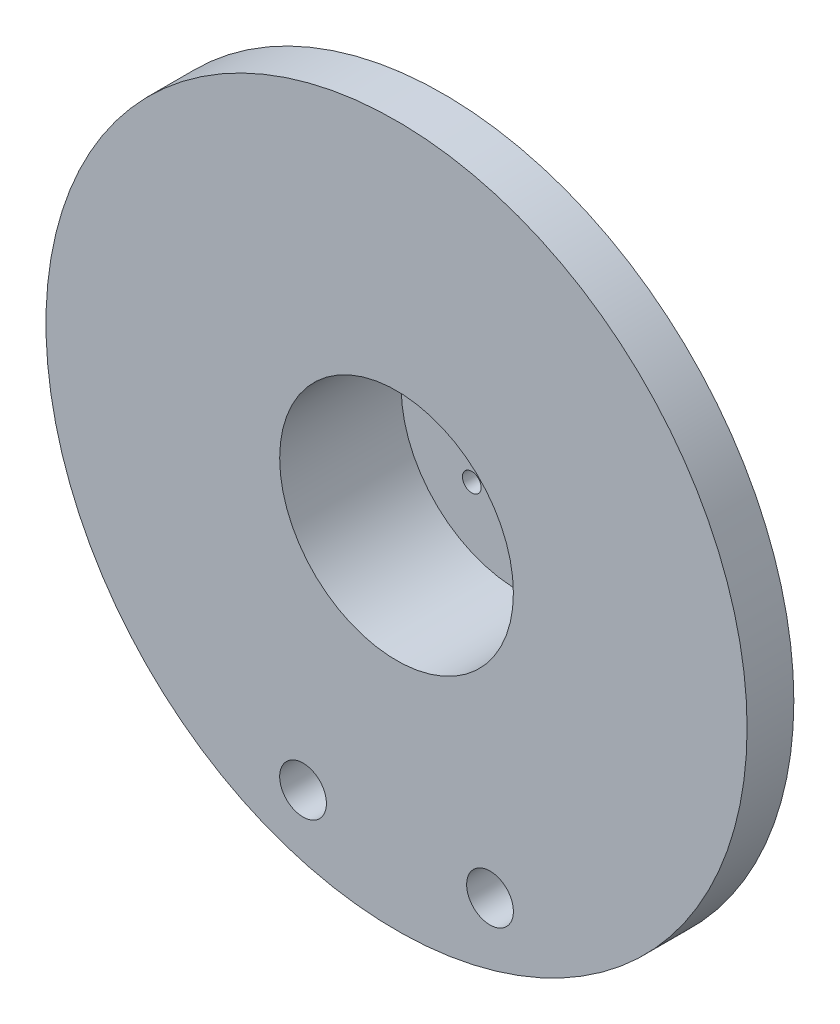
ISO-10303-21;
HEADER;
FILE_DESCRIPTION(('STEP AP214'),'2;1');
FILE_NAME('part.step','',(''),(''),'','','');
FILE_SCHEMA(('AUTOMOTIVE_DESIGN { 1 0 10303 214 1 1 1 1 }'));
ENDSEC;
DATA;
#1=APPLICATION_CONTEXT('core data for automotive mechanical design processes');
#2=APPLICATION_PROTOCOL_DEFINITION('international standard','automotive_design',2000,#1);
#3=PRODUCT_CONTEXT('',#1,'mechanical');
#4=PRODUCT('Part','Part','',(#3));
#5=PRODUCT_RELATED_PRODUCT_CATEGORY('part','',(#4));
#6=PRODUCT_DEFINITION_FORMATION('','',#4);
#7=PRODUCT_DEFINITION_CONTEXT('part definition',#1,'design');
#8=PRODUCT_DEFINITION('design','',#6,#7);
#9=PRODUCT_DEFINITION_SHAPE('','',#8);
#10=(LENGTH_UNIT() NAMED_UNIT(*) SI_UNIT(.MILLI.,.METRE.));
#11=(NAMED_UNIT(*) PLANE_ANGLE_UNIT() SI_UNIT($,.RADIAN.));
#12=(NAMED_UNIT(*) SI_UNIT($,.STERADIAN.) SOLID_ANGLE_UNIT());
#13=UNCERTAINTY_MEASURE_WITH_UNIT(LENGTH_MEASURE(1.E-05),#10,'distance_accuracy_value','');
#14=(GEOMETRIC_REPRESENTATION_CONTEXT(3) GLOBAL_UNCERTAINTY_ASSIGNED_CONTEXT((#13)) GLOBAL_UNIT_ASSIGNED_CONTEXT((#10,
#11,#12)) REPRESENTATION_CONTEXT('',''));
#15=CARTESIAN_POINT('',(0.,0.,0.));
#16=DIRECTION('',(0.,0.,1.));
#17=DIRECTION('',(1.,0.,0.));
#18=AXIS2_PLACEMENT_3D('',#15,#16,#17);
#19=CARTESIAN_POINT('',(0.,0.,5.));
#20=DIRECTION('',(0.,0.,-1.));
#21=DIRECTION('',(-1.,0.,0.));
#22=AXIS2_PLACEMENT_3D('',#19,#20,#21);
#23=CYLINDRICAL_SURFACE('',#22,12.5);
#24=CARTESIAN_POINT('',(0.,0.,5.));
#25=DIRECTION('',(0.,0.,1.));
#26=DIRECTION('',(1.,0.,0.));
#27=AXIS2_PLACEMENT_3D('',#24,#25,#26);
#28=CIRCLE('',#27,12.5);
#29=CARTESIAN_POINT('',(12.5,0.,5.));
#30=VERTEX_POINT('',#29);
#31=EDGE_CURVE('E48',#30,#30,#28,.T.);
#32=ORIENTED_EDGE('',*,*,#31,.T.);
#33=EDGE_LOOP('',(#32));
#34=FACE_BOUND('',#33,.T.);
#35=CARTESIAN_POINT('',(0.,0.,-8.));
#36=DIRECTION('',(0.,0.,-1.));
#37=DIRECTION('',(-1.,0.,0.));
#38=AXIS2_PLACEMENT_3D('',#35,#36,#37);
#39=CIRCLE('',#38,12.5);
#40=CARTESIAN_POINT('',(-12.5,0.,-8.));
#41=VERTEX_POINT('',#40);
#42=EDGE_CURVE('E55',#41,#41,#39,.T.);
#43=ORIENTED_EDGE('',*,*,#42,.T.);
#44=EDGE_LOOP('',(#43));
#45=FACE_BOUND('',#44,.T.);
#46=ADVANCED_FACE('F32',(#34,#45),#23,.F.);
#47=CARTESIAN_POINT('',(0.,0.,0.));
#48=DIRECTION('',(0.,0.,1.));
#49=DIRECTION('',(1.,0.,0.));
#50=AXIS2_PLACEMENT_3D('',#47,#48,#49);
#51=PLANE('',#50);
#52=CARTESIAN_POINT('',(-10.,-29.5,0.));
#53=DIRECTION('',(0.,0.,1.));
#54=DIRECTION('',(1.,0.,0.));
#55=AXIS2_PLACEMENT_3D('',#52,#53,#54);
#56=CIRCLE('',#55,2.5);
#57=CARTESIAN_POINT('',(-7.5,-29.5,0.));
#58=VERTEX_POINT('',#57);
#59=EDGE_CURVE('E110',#58,#58,#56,.T.);
#60=ORIENTED_EDGE('',*,*,#59,.T.);
#61=EDGE_LOOP('',(#60));
#62=FACE_BOUND('',#61,.T.);
#63=CARTESIAN_POINT('',(10.,-29.5,0.));
#64=DIRECTION('',(0.,0.,1.));
#65=DIRECTION('',(1.,0.,0.));
#66=AXIS2_PLACEMENT_3D('',#63,#64,#65);
#67=CIRCLE('',#66,2.5);
#68=CARTESIAN_POINT('',(12.5,-29.5,0.));
#69=VERTEX_POINT('',#68);
#70=EDGE_CURVE('E116',#69,#69,#67,.T.);
#71=ORIENTED_EDGE('',*,*,#70,.T.);
#72=EDGE_LOOP('',(#71));
#73=FACE_BOUND('',#72,.T.);
#74=CARTESIAN_POINT('',(0.,0.,0.));
#75=DIRECTION('',(0.,0.,1.));
#76=DIRECTION('',(1.,0.,0.));
#77=AXIS2_PLACEMENT_3D('',#74,#75,#76);
#78=CIRCLE('',#77,37.5);
#79=CARTESIAN_POINT('',(37.5,0.,0.));
#80=VERTEX_POINT('',#79);
#81=EDGE_CURVE('E43',#80,#80,#78,.T.);
#82=ORIENTED_EDGE('',*,*,#81,.F.);
#83=EDGE_LOOP('',(#82));
#84=FACE_BOUND('',#83,.T.);
#85=CARTESIAN_POINT('',(0.,0.,0.));
#86=DIRECTION('',(0.,0.,1.));
#87=DIRECTION('',(1.,0.,0.));
#88=AXIS2_PLACEMENT_3D('',#85,#86,#87);
#89=CIRCLE('',#88,17.5);
#90=CARTESIAN_POINT('',(17.5,0.,0.));
#91=VERTEX_POINT('',#90);
#92=EDGE_CURVE('E10',#91,#91,#89,.F.);
#93=ORIENTED_EDGE('',*,*,#92,.F.);
#94=EDGE_LOOP('',(#93));
#95=FACE_BOUND('',#94,.T.);
#96=ADVANCED_FACE('F125',(#62,#73,#84,#95),#51,.F.);
#97=CARTESIAN_POINT('',(0.,0.,5.));
#98=DIRECTION('',(0.,0.,1.));
#99=DIRECTION('',(1.,0.,0.));
#100=AXIS2_PLACEMENT_3D('',#97,#98,#99);
#101=PLANE('',#100);
#102=CARTESIAN_POINT('',(-10.,-29.5,5.));
#103=DIRECTION('',(0.,0.,1.));
#104=DIRECTION('',(1.,0.,0.));
#105=AXIS2_PLACEMENT_3D('',#102,#103,#104);
#106=CIRCLE('',#105,2.5);
#107=CARTESIAN_POINT('',(-7.5,-29.5,5.));
#108=VERTEX_POINT('',#107);
#109=EDGE_CURVE('E119',#108,#108,#106,.T.);
#110=ORIENTED_EDGE('',*,*,#109,.F.);
#111=EDGE_LOOP('',(#110));
#112=FACE_BOUND('',#111,.T.);
#113=CARTESIAN_POINT('',(10.,-29.5,5.));
#114=DIRECTION('',(0.,0.,1.));
#115=DIRECTION('',(1.,0.,0.));
#116=AXIS2_PLACEMENT_3D('',#113,#114,#115);
#117=CIRCLE('',#116,2.5);
#118=CARTESIAN_POINT('',(12.5,-29.5,5.));
#119=VERTEX_POINT('',#118);
#120=EDGE_CURVE('E113',#119,#119,#117,.T.);
#121=ORIENTED_EDGE('',*,*,#120,.F.);
#122=EDGE_LOOP('',(#121));
#123=FACE_BOUND('',#122,.T.);
#124=CARTESIAN_POINT('',(0.,0.,5.));
#125=DIRECTION('',(0.,0.,1.));
#126=DIRECTION('',(1.,0.,0.));
#127=AXIS2_PLACEMENT_3D('',#124,#125,#126);
#128=CIRCLE('',#127,37.5);
#129=CARTESIAN_POINT('',(37.5,0.,5.));
#130=VERTEX_POINT('',#129);
#131=EDGE_CURVE('E39',#130,#130,#128,.T.);
#132=ORIENTED_EDGE('',*,*,#131,.T.);
#133=EDGE_LOOP('',(#132));
#134=FACE_BOUND('',#133,.T.);
#135=ORIENTED_EDGE('',*,*,#31,.F.);
#136=EDGE_LOOP('',(#135));
#137=FACE_BOUND('',#136,.T.);
#138=ADVANCED_FACE('F135',(#112,#123,#134,#137),#101,.T.);
#139=CARTESIAN_POINT('',(0.,0.,5.));
#140=DIRECTION('',(0.,0.,-1.));
#141=DIRECTION('',(-1.,0.,0.));
#142=AXIS2_PLACEMENT_3D('',#139,#140,#141);
#143=CYLINDRICAL_SURFACE('',#142,37.5);
#144=ORIENTED_EDGE('',*,*,#131,.F.);
#145=EDGE_LOOP('',(#144));
#146=FACE_BOUND('',#145,.T.);
#147=ORIENTED_EDGE('',*,*,#81,.T.);
#148=EDGE_LOOP('',(#147));
#149=FACE_BOUND('',#148,.T.);
#150=ADVANCED_FACE('F34',(#146,#149),#143,.T.);
#151=CARTESIAN_POINT('',(0.,0.,-13.));
#152=DIRECTION('',(0.,0.,-1.));
#153=DIRECTION('',(-1.,0.,0.));
#154=AXIS2_PLACEMENT_3D('',#151,#152,#153);
#155=PLANE('',#154);
#156=CARTESIAN_POINT('',(0.,0.,-13.));
#157=DIRECTION('',(0.,0.,-1.));
#158=DIRECTION('',(-1.,0.,0.));
#159=AXIS2_PLACEMENT_3D('',#156,#157,#158);
#160=CIRCLE('',#159,17.5);
#161=CARTESIAN_POINT('',(17.5,0.,-13.));
#162=VERTEX_POINT('',#161);
#163=EDGE_CURVE('E52',#162,#162,#160,.T.);
#164=ORIENTED_EDGE('',*,*,#163,.T.);
#165=EDGE_LOOP('',(#164));
#166=FACE_BOUND('',#165,.T.);
#167=CARTESIAN_POINT('',(-4.94974746830589,4.94974746830577,-13.));
#168=DIRECTION('',(0.,0.,-1.));
#169=DIRECTION('',(-1.,0.,0.));
#170=AXIS2_PLACEMENT_3D('',#167,#168,#169);
#171=CIRCLE('',#170,1.);
#172=CARTESIAN_POINT('',(-5.94974746830589,4.94974746830577,-13.));
#173=VERTEX_POINT('',#172);
#174=EDGE_CURVE('E107',#173,#173,#171,.T.);
#175=ORIENTED_EDGE('',*,*,#174,.F.);
#176=EDGE_LOOP('',(#175));
#177=FACE_BOUND('',#176,.T.);
#178=CARTESIAN_POINT('',(0.,7.,-13.));
#179=DIRECTION('',(0.,0.,-1.));
#180=DIRECTION('',(-1.,0.,0.));
#181=AXIS2_PLACEMENT_3D('',#178,#179,#180);
#182=CIRCLE('',#181,1.);
#183=CARTESIAN_POINT('',(-1.00000000000007,7.,-13.));
#184=VERTEX_POINT('',#183);
#185=EDGE_CURVE('E101',#184,#184,#182,.T.);
#186=ORIENTED_EDGE('',*,*,#185,.F.);
#187=EDGE_LOOP('',(#186));
#188=FACE_BOUND('',#187,.T.);
#189=CARTESIAN_POINT('',(4.94974746830579,4.94974746830588,-13.));
#190=DIRECTION('',(0.,0.,-1.));
#191=DIRECTION('',(-1.,0.,0.));
#192=AXIS2_PLACEMENT_3D('',#189,#190,#191);
#193=CIRCLE('',#192,1.);
#194=CARTESIAN_POINT('',(3.94974746830579,4.94974746830588,-13.));
#195=VERTEX_POINT('',#194);
#196=EDGE_CURVE('E95',#195,#195,#193,.T.);
#197=ORIENTED_EDGE('',*,*,#196,.F.);
#198=EDGE_LOOP('',(#197));
#199=FACE_BOUND('',#198,.T.);
#200=CARTESIAN_POINT('',(7.,0.,-13.));
#201=DIRECTION('',(0.,0.,-1.));
#202=DIRECTION('',(-1.,0.,0.));
#203=AXIS2_PLACEMENT_3D('',#200,#201,#202);
#204=CIRCLE('',#203,1.);
#205=CARTESIAN_POINT('',(6.,0.,-13.));
#206=VERTEX_POINT('',#205);
#207=EDGE_CURVE('E89',#206,#206,#204,.T.);
#208=ORIENTED_EDGE('',*,*,#207,.F.);
#209=EDGE_LOOP('',(#208));
#210=FACE_BOUND('',#209,.T.);
#211=CARTESIAN_POINT('',(4.94974746830586,-4.94974746830581,-13.));
#212=DIRECTION('',(0.,0.,-1.));
#213=DIRECTION('',(-1.,0.,0.));
#214=AXIS2_PLACEMENT_3D('',#211,#212,#213);
#215=CIRCLE('',#214,1.);
#216=CARTESIAN_POINT('',(3.94974746830586,-4.94974746830581,-13.));
#217=VERTEX_POINT('',#216);
#218=EDGE_CURVE('E83',#217,#217,#215,.T.);
#219=ORIENTED_EDGE('',*,*,#218,.F.);
#220=EDGE_LOOP('',(#219));
#221=FACE_BOUND('',#220,.T.);
#222=CARTESIAN_POINT('',(0.,-7.,-13.));
#223=DIRECTION('',(0.,0.,-1.));
#224=DIRECTION('',(-1.,0.,0.));
#225=AXIS2_PLACEMENT_3D('',#222,#223,#224);
#226=CIRCLE('',#225,1.);
#227=CARTESIAN_POINT('',(-0.999999999999977,-7.,-13.));
#228=VERTEX_POINT('',#227);
#229=EDGE_CURVE('E77',#228,#228,#226,.T.);
#230=ORIENTED_EDGE('',*,*,#229,.F.);
#231=EDGE_LOOP('',(#230));
#232=FACE_BOUND('',#231,.T.);
#233=CARTESIAN_POINT('',(-4.94974746830583,-4.94974746830584,-13.));
#234=DIRECTION('',(0.,0.,-1.));
#235=DIRECTION('',(-1.,0.,0.));
#236=AXIS2_PLACEMENT_3D('',#233,#234,#235);
#237=CIRCLE('',#236,1.);
#238=CARTESIAN_POINT('',(-5.94974746830583,-4.94974746830584,-13.));
#239=VERTEX_POINT('',#238);
#240=EDGE_CURVE('E71',#239,#239,#237,.T.);
#241=ORIENTED_EDGE('',*,*,#240,.F.);
#242=EDGE_LOOP('',(#241));
#243=FACE_BOUND('',#242,.T.);
#244=CARTESIAN_POINT('',(-7.,0.,-13.));
#245=DIRECTION('',(0.,0.,-1.));
#246=DIRECTION('',(-1.,0.,0.));
#247=AXIS2_PLACEMENT_3D('',#244,#245,#246);
#248=CIRCLE('',#247,1.);
#249=CARTESIAN_POINT('',(-8.,0.,-13.));
#250=VERTEX_POINT('',#249);
#251=EDGE_CURVE('E65',#250,#250,#248,.T.);
#252=ORIENTED_EDGE('',*,*,#251,.F.);
#253=EDGE_LOOP('',(#252));
#254=FACE_BOUND('',#253,.T.);
#255=CARTESIAN_POINT('',(0.,0.,-13.));
#256=DIRECTION('',(0.,0.,-1.));
#257=DIRECTION('',(-1.,0.,0.));
#258=AXIS2_PLACEMENT_3D('',#255,#256,#257);
#259=CIRCLE('',#258,5.);
#260=CARTESIAN_POINT('',(-5.,0.,-13.));
#261=VERTEX_POINT('',#260);
#262=EDGE_CURVE('E59',#261,#261,#259,.T.);
#263=ORIENTED_EDGE('',*,*,#262,.F.);
#264=EDGE_LOOP('',(#263));
#265=FACE_BOUND('',#264,.T.);
#266=ADVANCED_FACE('F161',(#166,#177,#188,#199,#210,#221,#232,#243,#254,#265),#155,.T.);
#267=CARTESIAN_POINT('',(0.,0.,-13.));
#268=DIRECTION('',(0.,0.,1.));
#269=DIRECTION('',(1.,0.,0.));
#270=AXIS2_PLACEMENT_3D('',#267,#268,#269);
#271=CYLINDRICAL_SURFACE('',#270,17.5);
#272=CARTESIAN_POINT('',(17.5,0.,-13.));
#273=CARTESIAN_POINT('',(17.5,0.,-12.8645833333333));
#274=CARTESIAN_POINT('',(17.5,0.,-12.7291666666667));
#275=CARTESIAN_POINT('',(17.5,0.,-12.4583333333333));
#276=CARTESIAN_POINT('',(17.5,0.,-12.3229166666667));
#277=CARTESIAN_POINT('',(17.5,0.,-12.0520833333333));
#278=CARTESIAN_POINT('',(17.5,0.,-11.9166666666667));
#279=CARTESIAN_POINT('',(17.5,0.,-11.6458333333333));
#280=CARTESIAN_POINT('',(17.5,0.,-11.5104166666667));
#281=CARTESIAN_POINT('',(17.5,0.,-11.2395833333333));
#282=CARTESIAN_POINT('',(17.5,0.,-11.1041666666667));
#283=CARTESIAN_POINT('',(17.5,0.,-10.8333333333333));
#284=CARTESIAN_POINT('',(17.5,0.,-10.6979166666667));
#285=CARTESIAN_POINT('',(17.5,0.,-10.4270833333333));
#286=CARTESIAN_POINT('',(17.5,0.,-10.2916666666667));
#287=CARTESIAN_POINT('',(17.5,0.,-10.0208333333333));
#288=CARTESIAN_POINT('',(17.5,0.,-9.88541666666667));
#289=CARTESIAN_POINT('',(17.5,0.,-9.61458333333333));
#290=CARTESIAN_POINT('',(17.5,0.,-9.47916666666667));
#291=CARTESIAN_POINT('',(17.5,0.,-9.20833333333333));
#292=CARTESIAN_POINT('',(17.5,0.,-9.07291666666667));
#293=CARTESIAN_POINT('',(17.5,0.,-8.80208333333333));
#294=CARTESIAN_POINT('',(17.5,0.,-8.66666666666667));
#295=CARTESIAN_POINT('',(17.5,0.,-8.39583333333333));
#296=CARTESIAN_POINT('',(17.5,0.,-8.26041666666667));
#297=CARTESIAN_POINT('',(17.5,0.,-7.98958333333333));
#298=CARTESIAN_POINT('',(17.5,0.,-7.85416666666667));
#299=CARTESIAN_POINT('',(17.5,0.,-7.58333333333333));
#300=CARTESIAN_POINT('',(17.5,0.,-7.44791666666667));
#301=CARTESIAN_POINT('',(17.5,0.,-7.17708333333333));
#302=CARTESIAN_POINT('',(17.5,0.,-7.04166666666667));
#303=CARTESIAN_POINT('',(17.5,0.,-6.77083333333333));
#304=CARTESIAN_POINT('',(17.5,0.,-6.63541666666667));
#305=CARTESIAN_POINT('',(17.5,0.,-6.36458333333333));
#306=CARTESIAN_POINT('',(17.5,0.,-6.22916666666667));
#307=CARTESIAN_POINT('',(17.5,0.,-5.95833333333333));
#308=CARTESIAN_POINT('',(17.5,0.,-5.82291666666667));
#309=CARTESIAN_POINT('',(17.5,0.,-5.55208333333333));
#310=CARTESIAN_POINT('',(17.5,0.,-5.41666666666667));
#311=CARTESIAN_POINT('',(17.5,0.,-5.14583333333333));
#312=CARTESIAN_POINT('',(17.5,0.,-5.01041666666667));
#313=CARTESIAN_POINT('',(17.5,0.,-4.73958333333333));
#314=CARTESIAN_POINT('',(17.5,0.,-4.60416666666667));
#315=CARTESIAN_POINT('',(17.5,0.,-4.33333333333333));
#316=CARTESIAN_POINT('',(17.5,0.,-4.19791666666667));
#317=CARTESIAN_POINT('',(17.5,0.,-3.92708333333333));
#318=CARTESIAN_POINT('',(17.5,0.,-3.79166666666667));
#319=CARTESIAN_POINT('',(17.5,0.,-3.52083333333333));
#320=CARTESIAN_POINT('',(17.5,0.,-3.38541666666667));
#321=CARTESIAN_POINT('',(17.5,0.,-3.11458333333333));
#322=CARTESIAN_POINT('',(17.5,0.,-2.97916666666667));
#323=CARTESIAN_POINT('',(17.5,0.,-2.70833333333333));
#324=CARTESIAN_POINT('',(17.5,0.,-2.57291666666667));
#325=CARTESIAN_POINT('',(17.5,0.,-2.30208333333333));
#326=CARTESIAN_POINT('',(17.5,0.,-2.16666666666667));
#327=CARTESIAN_POINT('',(17.5,0.,-1.89583333333333));
#328=CARTESIAN_POINT('',(17.5,0.,-1.76041666666667));
#329=CARTESIAN_POINT('',(17.5,0.,-1.48958333333333));
#330=CARTESIAN_POINT('',(17.5,0.,-1.35416666666667));
#331=CARTESIAN_POINT('',(17.5,0.,-1.08333333333333));
#332=CARTESIAN_POINT('',(17.5,0.,-0.947916666666667));
#333=CARTESIAN_POINT('',(17.5,0.,-0.677083333333334));
#334=CARTESIAN_POINT('',(17.5,0.,-0.541666666666667));
#335=CARTESIAN_POINT('',(17.5,0.,-0.270833333333334));
#336=CARTESIAN_POINT('',(17.5,0.,-0.135416666666667));
#337=CARTESIAN_POINT('',(17.5,0.,0.));
#338=B_SPLINE_CURVE_WITH_KNOTS('',3,(#272,#273,#274,#275,#276,#277,#278,#279,#280,#281,#282,
#283,#284,#285,#286,#287,#288,#289,#290,#291,#292,#293,#294,#295,#296,#297,#298,#299,#300,#301,
#302,#303,#304,#305,#306,#307,#308,#309,#310,#311,#312,#313,#314,#315,#316,#317,#318,#319,#320,
#321,#322,#323,#324,#325,#326,#327,#328,#329,#330,#331,#332,#333,#334,#335,#336,#337),
.UNSPECIFIED.,.F.,.F.,(4,2,2,2,2,2,2,2,2,2,2,2,2,2,2,2,2,2,2,2,2,2,2,2,2,2,2,2,2,2,2,2,4),(0.,
0.406249999999999,0.812499999999999,1.21875,1.625,2.03125,2.4375,2.84375,3.25,3.65625,4.0625,
4.46875,4.875,5.28125,5.6875,6.09375,6.5,6.90625,7.3125,7.71875,8.125,8.53125,8.9375,9.34375,
9.75,10.15625,10.5625,10.96875,11.375,11.78125,12.1875,12.59375,13.),.UNSPECIFIED.);
#339=EDGE_CURVE('BSEAM151',#162,#91,#338,.T.);
#340=ORIENTED_EDGE('',*,*,#163,.F.);
#341=ORIENTED_EDGE('',*,*,#92,.T.);
#342=ORIENTED_EDGE('',*,*,#339,.T.);
#343=ORIENTED_EDGE('',*,*,#339,.F.);
#344=EDGE_LOOP('',(#340,#342,#341,#343));
#345=FACE_BOUND('',#344,.T.);
#346=ADVANCED_FACE('F151',(#345),#271,.T.);
#347=CARTESIAN_POINT('',(0.,0.,-8.));
#348=DIRECTION('',(0.,0.,-1.));
#349=DIRECTION('',(-1.,0.,0.));
#350=AXIS2_PLACEMENT_3D('',#347,#348,#349);
#351=PLANE('',#350);
#352=CARTESIAN_POINT('',(-4.94974746830589,4.94974746830577,-8.));
#353=DIRECTION('',(0.,0.,-1.));
#354=DIRECTION('',(-1.,0.,0.));
#355=AXIS2_PLACEMENT_3D('',#352,#353,#354);
#356=CIRCLE('',#355,1.);
#357=CARTESIAN_POINT('',(-5.94974746830589,4.94974746830577,-8.));
#358=VERTEX_POINT('',#357);
#359=EDGE_CURVE('E104',#358,#358,#356,.T.);
#360=ORIENTED_EDGE('',*,*,#359,.T.);
#361=EDGE_LOOP('',(#360));
#362=FACE_BOUND('',#361,.T.);
#363=CARTESIAN_POINT('',(0.,7.,-8.));
#364=DIRECTION('',(0.,0.,-1.));
#365=DIRECTION('',(-1.,0.,0.));
#366=AXIS2_PLACEMENT_3D('',#363,#364,#365);
#367=CIRCLE('',#366,1.);
#368=CARTESIAN_POINT('',(-1.00000000000007,7.,-8.));
#369=VERTEX_POINT('',#368);
#370=EDGE_CURVE('E98',#369,#369,#367,.T.);
#371=ORIENTED_EDGE('',*,*,#370,.T.);
#372=EDGE_LOOP('',(#371));
#373=FACE_BOUND('',#372,.T.);
#374=CARTESIAN_POINT('',(4.94974746830579,4.94974746830588,-8.));
#375=DIRECTION('',(0.,0.,-1.));
#376=DIRECTION('',(-1.,0.,0.));
#377=AXIS2_PLACEMENT_3D('',#374,#375,#376);
#378=CIRCLE('',#377,1.);
#379=CARTESIAN_POINT('',(3.94974746830579,4.94974746830588,-8.));
#380=VERTEX_POINT('',#379);
#381=EDGE_CURVE('E92',#380,#380,#378,.T.);
#382=ORIENTED_EDGE('',*,*,#381,.T.);
#383=EDGE_LOOP('',(#382));
#384=FACE_BOUND('',#383,.T.);
#385=CARTESIAN_POINT('',(7.,0.,-8.));
#386=DIRECTION('',(0.,0.,-1.));
#387=DIRECTION('',(-1.,0.,0.));
#388=AXIS2_PLACEMENT_3D('',#385,#386,#387);
#389=CIRCLE('',#388,1.);
#390=CARTESIAN_POINT('',(6.,0.,-8.));
#391=VERTEX_POINT('',#390);
#392=EDGE_CURVE('E86',#391,#391,#389,.T.);
#393=ORIENTED_EDGE('',*,*,#392,.T.);
#394=EDGE_LOOP('',(#393));
#395=FACE_BOUND('',#394,.T.);
#396=CARTESIAN_POINT('',(4.94974746830586,-4.94974746830581,-8.));
#397=DIRECTION('',(0.,0.,-1.));
#398=DIRECTION('',(-1.,0.,0.));
#399=AXIS2_PLACEMENT_3D('',#396,#397,#398);
#400=CIRCLE('',#399,1.);
#401=CARTESIAN_POINT('',(3.94974746830586,-4.94974746830581,-8.));
#402=VERTEX_POINT('',#401);
#403=EDGE_CURVE('E80',#402,#402,#400,.T.);
#404=ORIENTED_EDGE('',*,*,#403,.T.);
#405=EDGE_LOOP('',(#404));
#406=FACE_BOUND('',#405,.T.);
#407=CARTESIAN_POINT('',(0.,-7.,-8.));
#408=DIRECTION('',(0.,0.,-1.));
#409=DIRECTION('',(-1.,0.,0.));
#410=AXIS2_PLACEMENT_3D('',#407,#408,#409);
#411=CIRCLE('',#410,1.);
#412=CARTESIAN_POINT('',(-0.999999999999977,-7.,-8.));
#413=VERTEX_POINT('',#412);
#414=EDGE_CURVE('E74',#413,#413,#411,.T.);
#415=ORIENTED_EDGE('',*,*,#414,.T.);
#416=EDGE_LOOP('',(#415));
#417=FACE_BOUND('',#416,.T.);
#418=CARTESIAN_POINT('',(-4.94974746830583,-4.94974746830584,-8.));
#419=DIRECTION('',(0.,0.,-1.));
#420=DIRECTION('',(-1.,0.,0.));
#421=AXIS2_PLACEMENT_3D('',#418,#419,#420);
#422=CIRCLE('',#421,1.);
#423=CARTESIAN_POINT('',(-5.94974746830583,-4.94974746830584,-8.));
#424=VERTEX_POINT('',#423);
#425=EDGE_CURVE('E68',#424,#424,#422,.T.);
#426=ORIENTED_EDGE('',*,*,#425,.T.);
#427=EDGE_LOOP('',(#426));
#428=FACE_BOUND('',#427,.T.);
#429=CARTESIAN_POINT('',(-7.,0.,-8.));
#430=DIRECTION('',(0.,0.,-1.));
#431=DIRECTION('',(-1.,0.,0.));
#432=AXIS2_PLACEMENT_3D('',#429,#430,#431);
#433=CIRCLE('',#432,1.);
#434=CARTESIAN_POINT('',(-8.,0.,-8.));
#435=VERTEX_POINT('',#434);
#436=EDGE_CURVE('E62',#435,#435,#433,.T.);
#437=ORIENTED_EDGE('',*,*,#436,.T.);
#438=EDGE_LOOP('',(#437));
#439=FACE_BOUND('',#438,.T.);
#440=CARTESIAN_POINT('',(0.,0.,-8.));
#441=DIRECTION('',(0.,0.,-1.));
#442=DIRECTION('',(-1.,0.,0.));
#443=AXIS2_PLACEMENT_3D('',#440,#441,#442);
#444=CIRCLE('',#443,5.);
#445=CARTESIAN_POINT('',(-5.,0.,-8.));
#446=VERTEX_POINT('',#445);
#447=EDGE_CURVE('E58',#446,#446,#444,.T.);
#448=ORIENTED_EDGE('',*,*,#447,.T.);
#449=EDGE_LOOP('',(#448));
#450=FACE_BOUND('',#449,.T.);
#451=ORIENTED_EDGE('',*,*,#42,.F.);
#452=EDGE_LOOP('',(#451));
#453=FACE_BOUND('',#452,.T.);
#454=ADVANCED_FACE('F148',(#362,#373,#384,#395,#406,#417,#428,#439,#450,#453),#351,.F.);
#455=CARTESIAN_POINT('',(0.,0.,-8.));
#456=DIRECTION('',(0.,0.,-1.));
#457=DIRECTION('',(-1.,0.,0.));
#458=AXIS2_PLACEMENT_3D('',#455,#456,#457);
#459=CYLINDRICAL_SURFACE('',#458,5.);
#460=ORIENTED_EDGE('',*,*,#447,.F.);
#461=EDGE_LOOP('',(#460));
#462=FACE_BOUND('',#461,.T.);
#463=ORIENTED_EDGE('',*,*,#262,.T.);
#464=EDGE_LOOP('',(#463));
#465=FACE_BOUND('',#464,.T.);
#466=ADVANCED_FACE('F150',(#462,#465),#459,.F.);
#467=CARTESIAN_POINT('',(-7.,0.,-8.));
#468=DIRECTION('',(0.,0.,-1.));
#469=DIRECTION('',(-1.,0.,0.));
#470=AXIS2_PLACEMENT_3D('',#467,#468,#469);
#471=CYLINDRICAL_SURFACE('',#470,1.);
#472=ORIENTED_EDGE('',*,*,#436,.F.);
#473=EDGE_LOOP('',(#472));
#474=FACE_BOUND('',#473,.T.);
#475=ORIENTED_EDGE('',*,*,#251,.T.);
#476=EDGE_LOOP('',(#475));
#477=FACE_BOUND('',#476,.T.);
#478=ADVANCED_FACE('F158',(#474,#477),#471,.F.);
#479=CARTESIAN_POINT('',(-4.94974746830583,-4.94974746830584,-8.));
#480=DIRECTION('',(0.,0.,-1.));
#481=DIRECTION('',(-1.,0.,0.));
#482=AXIS2_PLACEMENT_3D('',#479,#480,#481);
#483=CYLINDRICAL_SURFACE('',#482,1.);
#484=ORIENTED_EDGE('',*,*,#425,.F.);
#485=EDGE_LOOP('',(#484));
#486=FACE_BOUND('',#485,.T.);
#487=ORIENTED_EDGE('',*,*,#240,.T.);
#488=EDGE_LOOP('',(#487));
#489=FACE_BOUND('',#488,.T.);
#490=ADVANCED_FACE('F225',(#486,#489),#483,.F.);
#491=CARTESIAN_POINT('',(0.,-7.,-8.));
#492=DIRECTION('',(0.,0.,-1.));
#493=DIRECTION('',(-1.,0.,0.));
#494=AXIS2_PLACEMENT_3D('',#491,#492,#493);
#495=CYLINDRICAL_SURFACE('',#494,1.);
#496=ORIENTED_EDGE('',*,*,#414,.F.);
#497=EDGE_LOOP('',(#496));
#498=FACE_BOUND('',#497,.T.);
#499=ORIENTED_EDGE('',*,*,#229,.T.);
#500=EDGE_LOOP('',(#499));
#501=FACE_BOUND('',#500,.T.);
#502=ADVANCED_FACE('F233',(#498,#501),#495,.F.);
#503=CARTESIAN_POINT('',(4.94974746830586,-4.94974746830581,-8.));
#504=DIRECTION('',(0.,0.,-1.));
#505=DIRECTION('',(-1.,0.,0.));
#506=AXIS2_PLACEMENT_3D('',#503,#504,#505);
#507=CYLINDRICAL_SURFACE('',#506,1.);
#508=ORIENTED_EDGE('',*,*,#403,.F.);
#509=EDGE_LOOP('',(#508));
#510=FACE_BOUND('',#509,.T.);
#511=ORIENTED_EDGE('',*,*,#218,.T.);
#512=EDGE_LOOP('',(#511));
#513=FACE_BOUND('',#512,.T.);
#514=ADVANCED_FACE('F242',(#510,#513),#507,.F.);
#515=CARTESIAN_POINT('',(7.,0.,-8.));
#516=DIRECTION('',(0.,0.,-1.));
#517=DIRECTION('',(-1.,0.,0.));
#518=AXIS2_PLACEMENT_3D('',#515,#516,#517);
#519=CYLINDRICAL_SURFACE('',#518,1.);
#520=ORIENTED_EDGE('',*,*,#392,.F.);
#521=EDGE_LOOP('',(#520));
#522=FACE_BOUND('',#521,.T.);
#523=ORIENTED_EDGE('',*,*,#207,.T.);
#524=EDGE_LOOP('',(#523));
#525=FACE_BOUND('',#524,.T.);
#526=ADVANCED_FACE('F251',(#522,#525),#519,.F.);
#527=CARTESIAN_POINT('',(4.94974746830579,4.94974746830588,-8.));
#528=DIRECTION('',(0.,0.,-1.));
#529=DIRECTION('',(-1.,0.,0.));
#530=AXIS2_PLACEMENT_3D('',#527,#528,#529);
#531=CYLINDRICAL_SURFACE('',#530,1.);
#532=ORIENTED_EDGE('',*,*,#381,.F.);
#533=EDGE_LOOP('',(#532));
#534=FACE_BOUND('',#533,.T.);
#535=ORIENTED_EDGE('',*,*,#196,.T.);
#536=EDGE_LOOP('',(#535));
#537=FACE_BOUND('',#536,.T.);
#538=ADVANCED_FACE('F260',(#534,#537),#531,.F.);
#539=CARTESIAN_POINT('',(0.,7.,-8.));
#540=DIRECTION('',(0.,0.,-1.));
#541=DIRECTION('',(-1.,0.,0.));
#542=AXIS2_PLACEMENT_3D('',#539,#540,#541);
#543=CYLINDRICAL_SURFACE('',#542,1.);
#544=ORIENTED_EDGE('',*,*,#370,.F.);
#545=EDGE_LOOP('',(#544));
#546=FACE_BOUND('',#545,.T.);
#547=ORIENTED_EDGE('',*,*,#185,.T.);
#548=EDGE_LOOP('',(#547));
#549=FACE_BOUND('',#548,.T.);
#550=ADVANCED_FACE('F269',(#546,#549),#543,.F.);
#551=CARTESIAN_POINT('',(-4.94974746830589,4.94974746830577,-8.));
#552=DIRECTION('',(0.,0.,-1.));
#553=DIRECTION('',(-1.,0.,0.));
#554=AXIS2_PLACEMENT_3D('',#551,#552,#553);
#555=CYLINDRICAL_SURFACE('',#554,1.);
#556=ORIENTED_EDGE('',*,*,#359,.F.);
#557=EDGE_LOOP('',(#556));
#558=FACE_BOUND('',#557,.T.);
#559=ORIENTED_EDGE('',*,*,#174,.T.);
#560=EDGE_LOOP('',(#559));
#561=FACE_BOUND('',#560,.T.);
#562=ADVANCED_FACE('F278',(#558,#561),#555,.F.);
#563=CARTESIAN_POINT('',(10.,-29.5,0.));
#564=DIRECTION('',(0.,0.,1.));
#565=DIRECTION('',(1.,0.,0.));
#566=AXIS2_PLACEMENT_3D('',#563,#564,#565);
#567=CYLINDRICAL_SURFACE('',#566,2.5);
#568=ORIENTED_EDGE('',*,*,#70,.F.);
#569=EDGE_LOOP('',(#568));
#570=FACE_BOUND('',#569,.T.);
#571=ORIENTED_EDGE('',*,*,#120,.T.);
#572=EDGE_LOOP('',(#571));
#573=FACE_BOUND('',#572,.T.);
#574=ADVANCED_FACE('F131',(#570,#573),#567,.F.);
#575=CARTESIAN_POINT('',(-10.,-29.5,0.));
#576=DIRECTION('',(0.,0.,1.));
#577=DIRECTION('',(1.,0.,0.));
#578=AXIS2_PLACEMENT_3D('',#575,#576,#577);
#579=CYLINDRICAL_SURFACE('',#578,2.5);
#580=ORIENTED_EDGE('',*,*,#59,.F.);
#581=EDGE_LOOP('',(#580));
#582=FACE_BOUND('',#581,.T.);
#583=ORIENTED_EDGE('',*,*,#109,.T.);
#584=EDGE_LOOP('',(#583));
#585=FACE_BOUND('',#584,.T.);
#586=ADVANCED_FACE('F128',(#582,#585),#579,.F.);
#587=CLOSED_SHELL('',(#46,#96,#138,#150,#266,#346,#454,#466,#478,#490,#502,#514,#526,#538,#550,
#562,#574,#586));
#588=MANIFOLD_SOLID_BREP('B2',#587);
#589=ADVANCED_BREP_SHAPE_REPRESENTATION('',(#18,#588),#14);
#590=SHAPE_DEFINITION_REPRESENTATION(#9,#589);
ENDSEC;
END-ISO-10303-21;
